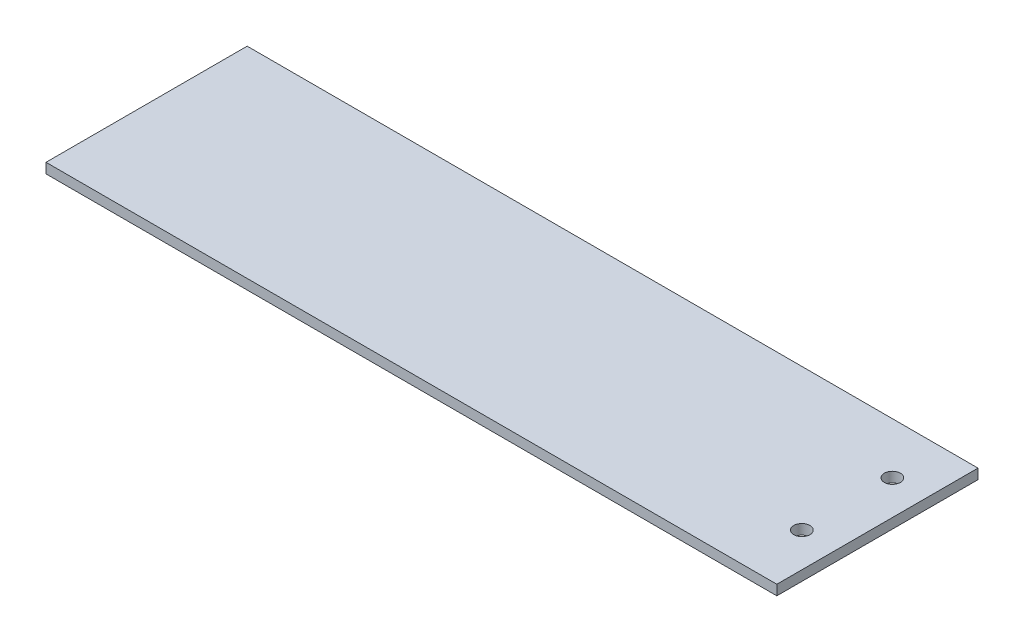
ISO-10303-21;
HEADER;
FILE_DESCRIPTION(('STEP AP214'),'2;1');
FILE_NAME('part.step','',(''),(''),'','','');
FILE_SCHEMA(('AUTOMOTIVE_DESIGN { 1 0 10303 214 1 1 1 1 }'));
ENDSEC;
DATA;
#1=APPLICATION_CONTEXT('core data for automotive mechanical design processes');
#2=APPLICATION_PROTOCOL_DEFINITION('international standard','automotive_design',2000,#1);
#3=PRODUCT_CONTEXT('',#1,'mechanical');
#4=PRODUCT('Part','Part','',(#3));
#5=PRODUCT_RELATED_PRODUCT_CATEGORY('part','',(#4));
#6=PRODUCT_DEFINITION_FORMATION('','',#4);
#7=PRODUCT_DEFINITION_CONTEXT('part definition',#1,'design');
#8=PRODUCT_DEFINITION('design','',#6,#7);
#9=PRODUCT_DEFINITION_SHAPE('','',#8);
#10=(LENGTH_UNIT() NAMED_UNIT(*) SI_UNIT(.MILLI.,.METRE.));
#11=(NAMED_UNIT(*) PLANE_ANGLE_UNIT() SI_UNIT($,.RADIAN.));
#12=(NAMED_UNIT(*) SI_UNIT($,.STERADIAN.) SOLID_ANGLE_UNIT());
#13=UNCERTAINTY_MEASURE_WITH_UNIT(LENGTH_MEASURE(1.E-05),#10,'distance_accuracy_value','');
#14=(GEOMETRIC_REPRESENTATION_CONTEXT(3) GLOBAL_UNCERTAINTY_ASSIGNED_CONTEXT((#13)) GLOBAL_UNIT_ASSIGNED_CONTEXT((#10,
#11,#12)) REPRESENTATION_CONTEXT('',''));
#15=CARTESIAN_POINT('',(0.,0.,0.));
#16=DIRECTION('',(0.,0.,1.));
#17=DIRECTION('',(1.,0.,0.));
#18=AXIS2_PLACEMENT_3D('',#15,#16,#17);
#19=CARTESIAN_POINT('',(0.,5.,0.));
#20=DIRECTION('',(0.,-1.,0.));
#21=DIRECTION('',(0.,0.,-1.));
#22=AXIS2_PLACEMENT_3D('',#19,#20,#21);
#23=PLANE('',#22);
#24=DIRECTION('',(0.,0.,-1.));
#25=VECTOR('',#24,1.);
#26=CARTESIAN_POINT('',(20.1396514884056,5.,50.));
#27=LINE('',#26,#25);
#28=CARTESIAN_POINT('',(20.1396514884056,5.,50.));
#29=VERTEX_POINT('',#28);
#30=CARTESIAN_POINT('',(20.1396514884056,5.,-50.));
#31=VERTEX_POINT('',#30);
#32=EDGE_CURVE('E85',#29,#31,#27,.T.);
#33=ORIENTED_EDGE('',*,*,#32,.T.);
#34=DIRECTION('',(-1.,0.,0.));
#35=VECTOR('',#34,1.);
#36=CARTESIAN_POINT('',(-343.160348511595,5.,-49.9999999999999));
#37=LINE('',#36,#35);
#38=CARTESIAN_POINT('',(-343.160348511595,5.,-49.9999999999999));
#39=VERTEX_POINT('',#38);
#40=EDGE_CURVE('E80',#31,#39,#37,.T.);
#41=ORIENTED_EDGE('',*,*,#40,.T.);
#42=DIRECTION('',(0.,0.,1.));
#43=VECTOR('',#42,1.);
#44=CARTESIAN_POINT('',(-343.160348511595,5.,50.));
#45=LINE('',#44,#43);
#46=CARTESIAN_POINT('',(-343.160348511595,5.,50.));
#47=VERTEX_POINT('',#46);
#48=EDGE_CURVE('E83',#39,#47,#45,.T.);
#49=ORIENTED_EDGE('',*,*,#48,.T.);
#50=DIRECTION('',(1.,0.,0.));
#51=VECTOR('',#50,1.);
#52=CARTESIAN_POINT('',(-343.160348511595,5.,50.));
#53=LINE('',#52,#51);
#54=EDGE_CURVE('E50',#47,#29,#53,.T.);
#55=ORIENTED_EDGE('',*,*,#54,.T.);
#56=EDGE_LOOP('',(#33,#41,#49,#55));
#57=FACE_BOUND('',#56,.T.);
#58=CARTESIAN_POINT('',(3.03965148840505,5.,-24.5346260456817));
#59=DIRECTION('',(0.,1.,0.));
#60=DIRECTION('',(0.,0.,1.));
#61=AXIS2_PLACEMENT_3D('',#58,#59,#60);
#62=CIRCLE('',#61,4.00000000000001);
#63=CARTESIAN_POINT('',(3.03965148840505,5.,-20.5346260456817));
#64=VERTEX_POINT('',#63);
#65=EDGE_CURVE('E100',#64,#64,#62,.T.);
#66=ORIENTED_EDGE('',*,*,#65,.F.);
#67=EDGE_LOOP('',(#66));
#68=FACE_BOUND('',#67,.T.);
#69=CARTESIAN_POINT('',(3.03965148840503,5.,20.4653739543183));
#70=DIRECTION('',(0.,1.,0.));
#71=DIRECTION('',(0.,0.,1.));
#72=AXIS2_PLACEMENT_3D('',#69,#70,#71);
#73=CIRCLE('',#72,4.00000000000001);
#74=CARTESIAN_POINT('',(3.03965148840503,5.,24.4653739543183));
#75=VERTEX_POINT('',#74);
#76=EDGE_CURVE('E115',#75,#75,#73,.T.);
#77=ORIENTED_EDGE('',*,*,#76,.F.);
#78=EDGE_LOOP('',(#77));
#79=FACE_BOUND('',#78,.T.);
#80=ADVANCED_FACE('F33',(#57,#68,#79),#23,.F.);
#81=CARTESIAN_POINT('',(0.,0.,0.));
#82=DIRECTION('',(0.,-1.,0.));
#83=DIRECTION('',(0.,0.,-1.));
#84=AXIS2_PLACEMENT_3D('',#81,#82,#83);
#85=PLANE('',#84);
#86=CARTESIAN_POINT('',(3.03965148840505,0.,-24.5346260456817));
#87=DIRECTION('',(0.,1.,0.));
#88=DIRECTION('',(0.,0.,1.));
#89=AXIS2_PLACEMENT_3D('',#86,#87,#88);
#90=CIRCLE('',#89,4.00000000000001);
#91=CARTESIAN_POINT('',(3.03965148840505,0.,-20.5346260456817));
#92=VERTEX_POINT('',#91);
#93=EDGE_CURVE('E112',#92,#92,#90,.T.);
#94=ORIENTED_EDGE('',*,*,#93,.T.);
#95=EDGE_LOOP('',(#94));
#96=FACE_BOUND('',#95,.T.);
#97=DIRECTION('',(0.,0.,-1.));
#98=VECTOR('',#97,1.);
#99=CARTESIAN_POINT('',(20.1396514884056,0.,50.));
#100=LINE('',#99,#98);
#101=CARTESIAN_POINT('',(20.1396514884056,0.,50.));
#102=VERTEX_POINT('',#101);
#103=CARTESIAN_POINT('',(20.1396514884056,0.,-50.));
#104=VERTEX_POINT('',#103);
#105=EDGE_CURVE('E97',#102,#104,#100,.T.);
#106=ORIENTED_EDGE('',*,*,#105,.F.);
#107=DIRECTION('',(1.,0.,0.));
#108=VECTOR('',#107,1.);
#109=CARTESIAN_POINT('',(-343.160348511595,0.,50.));
#110=LINE('',#109,#108);
#111=CARTESIAN_POINT('',(-343.160348511595,0.,50.));
#112=VERTEX_POINT('',#111);
#113=EDGE_CURVE('E73',#112,#102,#110,.T.);
#114=ORIENTED_EDGE('',*,*,#113,.F.);
#115=DIRECTION('',(0.,0.,1.));
#116=VECTOR('',#115,1.);
#117=CARTESIAN_POINT('',(-343.160348511595,0.,50.));
#118=LINE('',#117,#116);
#119=CARTESIAN_POINT('',(-343.160348511595,0.,-49.9999999999999));
#120=VERTEX_POINT('',#119);
#121=EDGE_CURVE('E67',#120,#112,#118,.T.);
#122=ORIENTED_EDGE('',*,*,#121,.F.);
#123=DIRECTION('',(-1.,0.,0.));
#124=VECTOR('',#123,1.);
#125=CARTESIAN_POINT('',(-343.160348511595,0.,-49.9999999999999));
#126=LINE('',#125,#124);
#127=EDGE_CURVE('E89',#104,#120,#126,.T.);
#128=ORIENTED_EDGE('',*,*,#127,.F.);
#129=EDGE_LOOP('',(#106,#114,#122,#128));
#130=FACE_BOUND('',#129,.T.);
#131=CARTESIAN_POINT('',(3.03965148840503,0.,20.4653739543183));
#132=DIRECTION('',(0.,1.,0.));
#133=DIRECTION('',(0.,0.,1.));
#134=AXIS2_PLACEMENT_3D('',#131,#132,#133);
#135=CIRCLE('',#134,4.00000000000001);
#136=CARTESIAN_POINT('',(3.03965148840503,0.,24.4653739543183));
#137=VERTEX_POINT('',#136);
#138=EDGE_CURVE('E118',#137,#137,#135,.T.);
#139=ORIENTED_EDGE('',*,*,#138,.T.);
#140=EDGE_LOOP('',(#139));
#141=FACE_BOUND('',#140,.T.);
#142=ADVANCED_FACE('F108',(#96,#130,#141),#85,.T.);
#143=CARTESIAN_POINT('',(20.1396514884056,5.,50.));
#144=DIRECTION('',(-1.,0.,0.));
#145=DIRECTION('',(0.,0.,1.));
#146=AXIS2_PLACEMENT_3D('',#143,#144,#145);
#147=PLANE('',#146);
#148=ORIENTED_EDGE('',*,*,#105,.T.);
#149=DIRECTION('',(0.,-1.,0.));
#150=VECTOR('',#149,1.);
#151=CARTESIAN_POINT('',(20.1396514884056,5.,-50.));
#152=LINE('',#151,#150);
#153=EDGE_CURVE('E11',#31,#104,#152,.T.);
#154=ORIENTED_EDGE('',*,*,#153,.F.);
#155=ORIENTED_EDGE('',*,*,#32,.F.);
#156=DIRECTION('',(0.,-1.,0.));
#157=VECTOR('',#156,1.);
#158=CARTESIAN_POINT('',(20.1396514884056,5.,50.));
#159=LINE('',#158,#157);
#160=EDGE_CURVE('E93',#29,#102,#159,.T.);
#161=ORIENTED_EDGE('',*,*,#160,.T.);
#162=EDGE_LOOP('',(#148,#154,#155,#161));
#163=FACE_BOUND('',#162,.T.);
#164=ADVANCED_FACE('F35',(#163),#147,.F.);
#165=CARTESIAN_POINT('',(-343.160348511595,5.,-49.9999999999999));
#166=DIRECTION('',(0.,0.,1.));
#167=DIRECTION('',(1.,0.,0.));
#168=AXIS2_PLACEMENT_3D('',#165,#166,#167);
#169=PLANE('',#168);
#170=ORIENTED_EDGE('',*,*,#127,.T.);
#171=DIRECTION('',(0.,-1.,0.));
#172=VECTOR('',#171,1.);
#173=CARTESIAN_POINT('',(-343.160348511595,5.,-49.9999999999999));
#174=LINE('',#173,#172);
#175=EDGE_CURVE('E42',#39,#120,#174,.T.);
#176=ORIENTED_EDGE('',*,*,#175,.F.);
#177=ORIENTED_EDGE('',*,*,#40,.F.);
#178=ORIENTED_EDGE('',*,*,#153,.T.);
#179=EDGE_LOOP('',(#170,#176,#177,#178));
#180=FACE_BOUND('',#179,.T.);
#181=ADVANCED_FACE('F88',(#180),#169,.F.);
#182=CARTESIAN_POINT('',(-343.160348511595,5.,50.));
#183=DIRECTION('',(1.,0.,0.));
#184=DIRECTION('',(0.,0.,-1.));
#185=AXIS2_PLACEMENT_3D('',#182,#183,#184);
#186=PLANE('',#185);
#187=ORIENTED_EDGE('',*,*,#121,.T.);
#188=DIRECTION('',(0.,-1.,0.));
#189=VECTOR('',#188,1.);
#190=CARTESIAN_POINT('',(-343.160348511595,5.,50.));
#191=LINE('',#190,#189);
#192=EDGE_CURVE('E90',#47,#112,#191,.T.);
#193=ORIENTED_EDGE('',*,*,#192,.F.);
#194=ORIENTED_EDGE('',*,*,#48,.F.);
#195=ORIENTED_EDGE('',*,*,#175,.T.);
#196=EDGE_LOOP('',(#187,#193,#194,#195));
#197=FACE_BOUND('',#196,.T.);
#198=ADVANCED_FACE('F91',(#197),#186,.F.);
#199=CARTESIAN_POINT('',(-343.160348511595,5.,50.));
#200=DIRECTION('',(0.,0.,-1.));
#201=DIRECTION('',(-1.,0.,0.));
#202=AXIS2_PLACEMENT_3D('',#199,#200,#201);
#203=PLANE('',#202);
#204=ORIENTED_EDGE('',*,*,#113,.T.);
#205=ORIENTED_EDGE('',*,*,#160,.F.);
#206=ORIENTED_EDGE('',*,*,#54,.F.);
#207=ORIENTED_EDGE('',*,*,#192,.T.);
#208=EDGE_LOOP('',(#204,#205,#206,#207));
#209=FACE_BOUND('',#208,.T.);
#210=ADVANCED_FACE('F105',(#209),#203,.F.);
#211=CARTESIAN_POINT('',(3.03965148840505,5.,-24.5346260456817));
#212=DIRECTION('',(0.,-1.,0.));
#213=DIRECTION('',(0.,0.,-1.));
#214=AXIS2_PLACEMENT_3D('',#211,#212,#213);
#215=CYLINDRICAL_SURFACE('',#214,4.00000000000001);
#216=ORIENTED_EDGE('',*,*,#65,.T.);
#217=EDGE_LOOP('',(#216));
#218=FACE_BOUND('',#217,.T.);
#219=ORIENTED_EDGE('',*,*,#93,.F.);
#220=EDGE_LOOP('',(#219));
#221=FACE_BOUND('',#220,.T.);
#222=ADVANCED_FACE('F135',(#218,#221),#215,.F.);
#223=CARTESIAN_POINT('',(3.03965148840503,5.,20.4653739543183));
#224=DIRECTION('',(0.,-1.,0.));
#225=DIRECTION('',(0.,0.,-1.));
#226=AXIS2_PLACEMENT_3D('',#223,#224,#225);
#227=CYLINDRICAL_SURFACE('',#226,4.00000000000001);
#228=ORIENTED_EDGE('',*,*,#76,.T.);
#229=EDGE_LOOP('',(#228));
#230=FACE_BOUND('',#229,.T.);
#231=ORIENTED_EDGE('',*,*,#138,.F.);
#232=EDGE_LOOP('',(#231));
#233=FACE_BOUND('',#232,.T.);
#234=ADVANCED_FACE('F124',(#230,#233),#227,.F.);
#235=CLOSED_SHELL('',(#80,#142,#164,#181,#198,#210,#222,#234));
#236=MANIFOLD_SOLID_BREP('B2',#235);
#237=ADVANCED_BREP_SHAPE_REPRESENTATION('',(#18,#236),#14);
#238=SHAPE_DEFINITION_REPRESENTATION(#9,#237);
ENDSEC;
END-ISO-10303-21;
